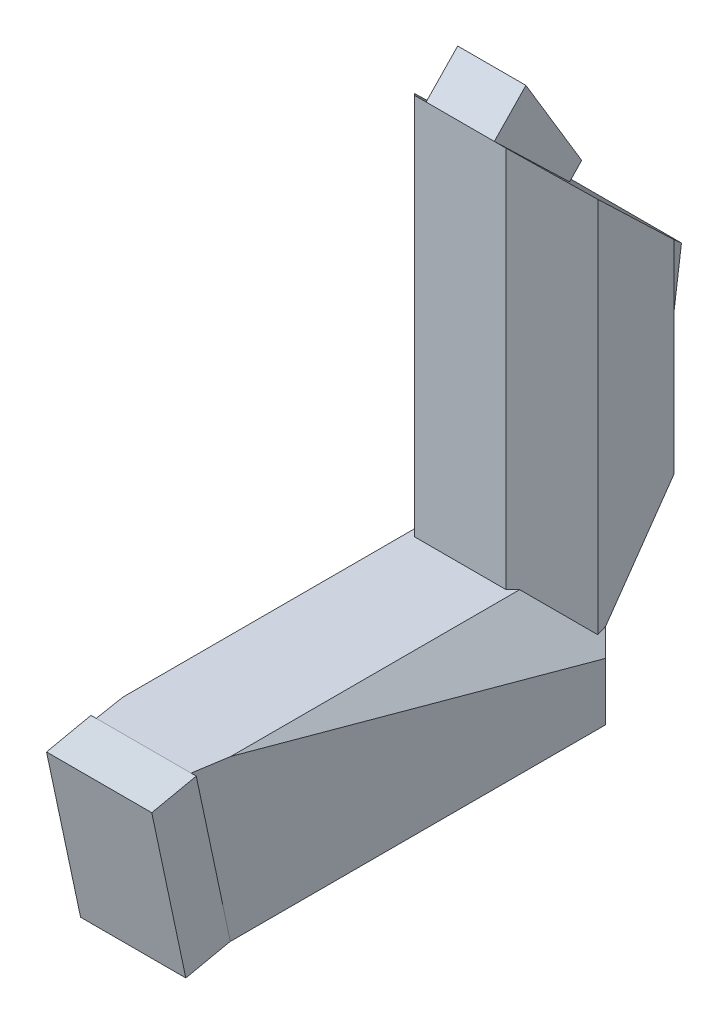
ISO-10303-21;
HEADER;
FILE_DESCRIPTION(('STEP AP214'),'2;1');
FILE_NAME('part.step','',(''),(''),'','','');
FILE_SCHEMA(('AUTOMOTIVE_DESIGN { 1 0 10303 214 1 1 1 1 }'));
ENDSEC;
DATA;
#1=APPLICATION_CONTEXT('core data for automotive mechanical design processes');
#2=APPLICATION_PROTOCOL_DEFINITION('international standard','automotive_design',2000,#1);
#3=PRODUCT_CONTEXT('',#1,'mechanical');
#4=PRODUCT('Part','Part','',(#3));
#5=PRODUCT_RELATED_PRODUCT_CATEGORY('part','',(#4));
#6=PRODUCT_DEFINITION_FORMATION('','',#4);
#7=PRODUCT_DEFINITION_CONTEXT('part definition',#1,'design');
#8=PRODUCT_DEFINITION('design','',#6,#7);
#9=PRODUCT_DEFINITION_SHAPE('','',#8);
#10=(LENGTH_UNIT() NAMED_UNIT(*) SI_UNIT(.MILLI.,.METRE.));
#11=(NAMED_UNIT(*) PLANE_ANGLE_UNIT() SI_UNIT($,.RADIAN.));
#12=(NAMED_UNIT(*) SI_UNIT($,.STERADIAN.) SOLID_ANGLE_UNIT());
#13=UNCERTAINTY_MEASURE_WITH_UNIT(LENGTH_MEASURE(1.E-05),#10,'distance_accuracy_value','');
#14=(GEOMETRIC_REPRESENTATION_CONTEXT(3) GLOBAL_UNCERTAINTY_ASSIGNED_CONTEXT((#13)) GLOBAL_UNIT_ASSIGNED_CONTEXT((#10,
#11,#12)) REPRESENTATION_CONTEXT('',''));
#15=CARTESIAN_POINT('',(0.,0.,0.));
#16=DIRECTION('',(0.,0.,1.));
#17=DIRECTION('',(1.,0.,0.));
#18=AXIS2_PLACEMENT_3D('',#15,#16,#17);
#19=CARTESIAN_POINT('',(-0.0406399999999992,16.9835922280597,2.22888333721219));
#20=DIRECTION('',(0.,-0.719339800338655,0.694658370458993));
#21=DIRECTION('',(1.,0.,0.));
#22=AXIS2_PLACEMENT_3D('',#19,#20,#21);
#23=PLANE('',#22);
#24=DIRECTION('',(-1.,0.,0.));
#25=VECTOR('',#24,1.);
#26=CARTESIAN_POINT('',(0.,22.8152871634944,8.26778022363376));
#27=LINE('',#26,#25);
#28=CARTESIAN_POINT('',(6.985,22.8152871634944,8.26778022363375));
#29=VERTEX_POINT('',#28);
#30=CARTESIAN_POINT('',(3.175,22.8152871634944,8.26778022363376));
#31=VERTEX_POINT('',#30);
#32=EDGE_CURVE('E246',#29,#31,#27,.T.);
#33=ORIENTED_EDGE('',*,*,#32,.F.);
#34=DIRECTION('',(0.,-0.694658370458993,-0.719339800338655));
#35=VECTOR('',#34,1.);
#36=CARTESIAN_POINT('',(6.985,7.67439274365707,-7.41107492601042));
#37=LINE('',#36,#35);
#38=CARTESIAN_POINT('',(6.985,26.8734813637158,12.4701633372122));
#39=VERTEX_POINT('',#38);
#40=EDGE_CURVE('E243',#39,#29,#37,.T.);
#41=ORIENTED_EDGE('',*,*,#40,.F.);
#42=DIRECTION('',(1.,0.,0.));
#43=VECTOR('',#42,1.);
#44=CARTESIAN_POINT('',(-0.0406399999999992,26.8734813637158,12.4701633372122));
#45=LINE('',#44,#43);
#46=CARTESIAN_POINT('',(7.64032,26.8734813637158,12.4701633372122));
#47=VERTEX_POINT('',#46);
#48=EDGE_CURVE('E414',#47,#39,#45,.F.);
#49=ORIENTED_EDGE('',*,*,#48,.F.);
#50=DIRECTION('',(-0.583951705334851,0.563915606871309,0.583951705334853));
#51=VECTOR('',#50,1.);
#52=CARTESIAN_POINT('',(15.1728378685033,19.5994134120685,4.93764546870888));
#53=LINE('',#52,#51);
#54=CARTESIAN_POINT('',(10.20064,24.4010090798018,9.90984333721217));
#55=VERTEX_POINT('',#54);
#56=EDGE_CURVE('E411',#55,#47,#53,.T.);
#57=ORIENTED_EDGE('',*,*,#56,.F.);
#58=DIRECTION('',(-0.125830861752583,-0.689137023900374,-0.713622278604262));
#59=VECTOR('',#58,1.);
#60=CARTESIAN_POINT('',(8.43149552116656,14.7119475569596,-0.123473581872873));
#61=LINE('',#60,#59);
#62=CARTESIAN_POINT('',(9.29087441650168,19.4185021023661,4.75030632340443));
#63=VERTEX_POINT('',#62);
#64=EDGE_CURVE('E409',#63,#55,#61,.F.);
#65=ORIENTED_EDGE('',*,*,#64,.F.);
#66=DIRECTION('',(0.449846069130696,0.620403631273811,0.642446766969786));
#67=VECTOR('',#66,1.);
#68=CARTESIAN_POINT('',(3.90156669892868,11.9858572323209,-2.94642275116742));
#69=LINE('',#68,#67);
#70=CARTESIAN_POINT('',(8.2976543894501,18.0487061794464,3.33184112151435));
#71=VERTEX_POINT('',#70);
#72=EDGE_CURVE('E407',#71,#63,#69,.T.);
#73=ORIENTED_EDGE('',*,*,#72,.F.);
#74=DIRECTION('',(1.,0.,0.));
#75=VECTOR('',#74,1.);
#76=CARTESIAN_POINT('',(0.,18.0487061794464,3.33184112151435));
#77=LINE('',#76,#75);
#78=CARTESIAN_POINT('',(1.8623456105499,18.0487061794464,3.33184112151435));
#79=VERTEX_POINT('',#78);
#80=EDGE_CURVE('E404',#79,#71,#77,.T.);
#81=ORIENTED_EDGE('',*,*,#80,.F.);
#82=DIRECTION('',(0.449846069130696,-0.620403631273811,-0.642446766969786));
#83=VECTOR('',#82,1.);
#84=CARTESIAN_POINT('',(6.25843330107131,11.9858572323209,-2.94642275116742));
#85=LINE('',#84,#83);
#86=CARTESIAN_POINT('',(0.869125583498314,19.4185021023661,4.75030632340443));
#87=VERTEX_POINT('',#86);
#88=EDGE_CURVE('E421',#87,#79,#85,.T.);
#89=ORIENTED_EDGE('',*,*,#88,.F.);
#90=DIRECTION('',(-0.125830861752583,0.689137023900374,0.713622278604262));
#91=VECTOR('',#90,1.);
#92=CARTESIAN_POINT('',(1.72850447883344,14.7119475569596,-0.123473581872865));
#93=LINE('',#92,#91);
#94=CARTESIAN_POINT('',(-0.0406400000000032,24.4010090798018,9.90984333721217));
#95=VERTEX_POINT('',#94);
#96=EDGE_CURVE('E419',#95,#87,#93,.F.);
#97=ORIENTED_EDGE('',*,*,#96,.F.);
#98=DIRECTION('',(-0.58395170533485,-0.563915606871309,-0.583951705334853));
#99=VECTOR('',#98,1.);
#100=CARTESIAN_POINT('',(-5.01283786850328,19.5994134120685,4.93764546870888));
#101=LINE('',#100,#99);
#102=CARTESIAN_POINT('',(2.51968,26.8734813637158,12.4701633372122));
#103=VERTEX_POINT('',#102);
#104=EDGE_CURVE('E417',#103,#95,#101,.T.);
#105=ORIENTED_EDGE('',*,*,#104,.F.);
#106=CARTESIAN_POINT('',(3.175,26.8734813637158,12.4701633372122));
#107=VERTEX_POINT('',#106);
#108=EDGE_CURVE('E413',#107,#103,#45,.F.);
#109=ORIENTED_EDGE('',*,*,#108,.F.);
#110=DIRECTION('',(0.,0.694658370458993,0.719339800338655));
#111=VECTOR('',#110,1.);
#112=CARTESIAN_POINT('',(3.175,7.67439274365707,-7.41107492601042));
#113=LINE('',#112,#111);
#114=EDGE_CURVE('E259',#31,#107,#113,.T.);
#115=ORIENTED_EDGE('',*,*,#114,.F.);
#116=EDGE_LOOP('',(#33,#41,#49,#57,#65,#73,#81,#89,#97,#105,#109,#115));
#117=FACE_BOUND('',#116,.T.);
#118=ADVANCED_FACE('F37',(#117),#23,.F.);
#119=CARTESIAN_POINT('',(2.63464496544535,3.99911222805982,2.22888333721219));
#120=DIRECTION('',(0.819152044288995,0.,0.573576436351042));
#121=DIRECTION('',(0.,1.,0.));
#122=AXIS2_PLACEMENT_3D('',#119,#120,#121);
#123=PLANE('',#122);
#124=DIRECTION('',(0.,-1.,0.));
#125=VECTOR('',#124,1.);
#126=CARTESIAN_POINT('',(0.869125583498317,3.99911222805982,4.75030632340443));
#127=LINE('',#126,#125);
#128=CARTESIAN_POINT('',(0.869125583498321,15.8644613126657,4.75030632340443));
#129=VERTEX_POINT('',#128);
#130=EDGE_CURVE('E297',#87,#129,#127,.T.);
#131=ORIENTED_EDGE('',*,*,#130,.F.);
#132=ORIENTED_EDGE('',*,*,#88,.T.);
#133=DIRECTION('',(-0.356328192511375,-0.783620954253866,0.508889397881147));
#134=VECTOR('',#133,1.);
#135=CARTESIAN_POINT('',(-1.76260983441045,10.0768670025143,8.50881401476351));
#136=LINE('',#135,#134);
#137=EDGE_CURVE('E305',#79,#129,#136,.T.);
#138=ORIENTED_EDGE('',*,*,#137,.T.);
#139=EDGE_LOOP('',(#131,#132,#138));
#140=FACE_BOUND('',#139,.T.);
#141=ADVANCED_FACE('F489',(#140),#123,.F.);
#142=CARTESIAN_POINT('',(7.52535503455466,3.99911222805982,2.22888333721219));
#143=DIRECTION('',(-0.819152044288994,0.,0.573576436351042));
#144=DIRECTION('',(0.,-1.,0.));
#145=AXIS2_PLACEMENT_3D('',#142,#143,#144);
#146=PLANE('',#145);
#147=DIRECTION('',(-0.356328192511376,0.783620954253866,-0.508889397881147));
#148=VECTOR('',#147,1.);
#149=CARTESIAN_POINT('',(11.9226098344105,10.0768670025143,8.50881401476351));
#150=LINE('',#149,#148);
#151=CARTESIAN_POINT('',(9.29087441650168,15.8644613126657,4.75030632340443));
#152=VERTEX_POINT('',#151);
#153=EDGE_CURVE('E302',#152,#71,#150,.T.);
#154=ORIENTED_EDGE('',*,*,#153,.T.);
#155=ORIENTED_EDGE('',*,*,#72,.T.);
#156=DIRECTION('',(0.,1.,0.));
#157=VECTOR('',#156,1.);
#158=CARTESIAN_POINT('',(9.29087441650168,3.99911222805982,4.75030632340443));
#159=LINE('',#158,#157);
#160=EDGE_CURVE('E299',#152,#63,#159,.T.);
#161=ORIENTED_EDGE('',*,*,#160,.F.);
#162=EDGE_LOOP('',(#154,#155,#161));
#163=FACE_BOUND('',#162,.T.);
#164=ADVANCED_FACE('F494',(#163),#146,.F.);
#165=CARTESIAN_POINT('',(-0.0406399999999992,3.99911222805982,12.4701633372122));
#166=DIRECTION('',(0.,0.,-1.));
#167=DIRECTION('',(-1.,0.,0.));
#168=AXIS2_PLACEMENT_3D('',#165,#166,#167);
#169=PLANE('',#168);
#170=DIRECTION('',(0.,1.,0.));
#171=VECTOR('',#170,1.);
#172=CARTESIAN_POINT('',(7.64032,3.99911222805982,12.4701633372122));
#173=LINE('',#172,#171);
#174=CARTESIAN_POINT('',(7.64032,5.52311222805981,12.4701633372122));
#175=VERTEX_POINT('',#174);
#176=EDGE_CURVE('E289',#175,#47,#173,.T.);
#177=ORIENTED_EDGE('',*,*,#176,.T.);
#178=ORIENTED_EDGE('',*,*,#48,.T.);
#179=DIRECTION('',(1.,0.,0.));
#180=VECTOR('',#179,1.);
#181=CARTESIAN_POINT('',(0.,26.8734813637158,12.4701633372122));
#182=LINE('',#181,#180);
#183=EDGE_CURVE('E255',#107,#39,#182,.T.);
#184=ORIENTED_EDGE('',*,*,#183,.F.);
#185=ORIENTED_EDGE('',*,*,#108,.T.);
#186=DIRECTION('',(0.,-1.,0.));
#187=VECTOR('',#186,1.);
#188=CARTESIAN_POINT('',(2.51968,3.99911222805982,12.4701633372122));
#189=LINE('',#188,#187);
#190=CARTESIAN_POINT('',(2.51967999999999,5.52311222805981,12.4701633372122));
#191=VERTEX_POINT('',#190);
#192=EDGE_CURVE('E287',#103,#191,#189,.T.);
#193=ORIENTED_EDGE('',*,*,#192,.T.);
#194=DIRECTION('',(1.,0.,0.));
#195=VECTOR('',#194,1.);
#196=CARTESIAN_POINT('',(-0.0406399999999992,5.52311222805981,12.4701633372122));
#197=LINE('',#196,#195);
#198=EDGE_CURVE('E278',#191,#175,#197,.T.);
#199=ORIENTED_EDGE('',*,*,#198,.T.);
#200=EDGE_LOOP('',(#177,#178,#184,#185,#193,#199));
#201=FACE_BOUND('',#200,.T.);
#202=ADVANCED_FACE('F514',(#201),#169,.F.);
#203=CARTESIAN_POINT('',(7.64032,3.99911222805982,12.4701633372122));
#204=DIRECTION('',(-0.707106781186549,0.,-0.707106781186546));
#205=DIRECTION('',(0.,1.,0.));
#206=AXIS2_PLACEMENT_3D('',#203,#204,#205);
#207=PLANE('',#206);
#208=DIRECTION('',(0.,-1.,0.));
#209=VECTOR('',#208,1.);
#210=CARTESIAN_POINT('',(10.20064,3.99911222805982,9.90984333721217));
#211=LINE('',#210,#209);
#212=CARTESIAN_POINT('',(10.20064,3.34334664456153,9.90984333721217));
#213=VERTEX_POINT('',#212);
#214=EDGE_CURVE('E292',#55,#213,#211,.T.);
#215=ORIENTED_EDGE('',*,*,#214,.F.);
#216=ORIENTED_EDGE('',*,*,#56,.T.);
#217=ORIENTED_EDGE('',*,*,#176,.F.);
#218=DIRECTION('',(0.707106781186546,0.,-0.707106781186549));
#219=VECTOR('',#218,1.);
#220=CARTESIAN_POINT('',(7.64032,5.52311222805981,12.4701633372122));
#221=LINE('',#220,#219);
#222=CARTESIAN_POINT('',(8.02087441650169,5.52311222805981,12.0896089207105));
#223=VERTEX_POINT('',#222);
#224=EDGE_CURVE('E275',#223,#175,#221,.F.);
#225=ORIENTED_EDGE('',*,*,#224,.F.);
#226=DIRECTION('',(0.577350269189624,-0.577350269189627,-0.577350269189626));
#227=VECTOR('',#226,1.);
#228=CARTESIAN_POINT('',(2.00064194893706,11.5433446956245,18.1098413882752));
#229=LINE('',#228,#227);
#230=EDGE_CURVE('E361',#223,#213,#229,.T.);
#231=ORIENTED_EDGE('',*,*,#230,.T.);
#232=EDGE_LOOP('',(#215,#216,#217,#225,#231));
#233=FACE_BOUND('',#232,.T.);
#234=ADVANCED_FACE('F520',(#233),#207,.F.);
#235=CARTESIAN_POINT('',(2.51968,3.99911222805982,12.4701633372122));
#236=DIRECTION('',(0.707106781186549,0.,-0.707106781186546));
#237=DIRECTION('',(0.,-1.,0.));
#238=AXIS2_PLACEMENT_3D('',#235,#236,#237);
#239=PLANE('',#238);
#240=ORIENTED_EDGE('',*,*,#192,.F.);
#241=ORIENTED_EDGE('',*,*,#104,.T.);
#242=DIRECTION('',(0.,1.,0.));
#243=VECTOR('',#242,1.);
#244=CARTESIAN_POINT('',(-0.0406399999999992,3.99911222805982,9.90984333721217));
#245=LINE('',#244,#243);
#246=CARTESIAN_POINT('',(-0.0406399999999991,3.34334664456152,9.90984333721217));
#247=VERTEX_POINT('',#246);
#248=EDGE_CURVE('E294',#247,#95,#245,.T.);
#249=ORIENTED_EDGE('',*,*,#248,.F.);
#250=DIRECTION('',(0.577350269189626,0.577350269189623,0.577350269189628));
#251=VECTOR('',#250,1.);
#252=CARTESIAN_POINT('',(5.61935805106301,9.00334469562446,15.5698413882752));
#253=LINE('',#252,#251);
#254=CARTESIAN_POINT('',(2.13912558349834,5.52311222805981,12.0896089207105));
#255=VERTEX_POINT('',#254);
#256=EDGE_CURVE('E369',#247,#255,#253,.T.);
#257=ORIENTED_EDGE('',*,*,#256,.T.);
#258=DIRECTION('',(0.707106781186546,0.,0.707106781186549));
#259=VECTOR('',#258,1.);
#260=CARTESIAN_POINT('',(2.51968,5.52311222805981,12.4701633372122));
#261=LINE('',#260,#259);
#262=EDGE_CURVE('E281',#191,#255,#261,.F.);
#263=ORIENTED_EDGE('',*,*,#262,.F.);
#264=EDGE_LOOP('',(#240,#241,#249,#257,#263));
#265=FACE_BOUND('',#264,.T.);
#266=ADVANCED_FACE('F544',(#265),#239,.F.);
#267=CARTESIAN_POINT('',(-0.0406399999999992,3.99911222805982,9.9098433372124));
#268=DIRECTION('',(-0.984807753012208,0.,-0.173648177666928));
#269=DIRECTION('',(0.,1.,0.));
#270=AXIS2_PLACEMENT_3D('',#267,#268,#269);
#271=PLANE('',#270);
#272=ORIENTED_EDGE('',*,*,#248,.T.);
#273=ORIENTED_EDGE('',*,*,#96,.T.);
#274=ORIENTED_EDGE('',*,*,#130,.T.);
#275=DIRECTION('',(0.,-1.,0.));
#276=VECTOR('',#275,1.);
#277=CARTESIAN_POINT('',(0.869125583498321,15.6831122280598,4.75030632340443));
#278=LINE('',#277,#276);
#279=CARTESIAN_POINT('',(0.869125583498321,8.06311222805982,4.75030632340443));
#280=VERTEX_POINT('',#279);
#281=EDGE_CURVE('E284',#129,#280,#278,.T.);
#282=ORIENTED_EDGE('',*,*,#281,.T.);
#283=DIRECTION('',(0.123724030206482,0.701673843159866,-0.701673843159862));
#284=VECTOR('',#283,1.);
#285=CARTESIAN_POINT('',(0.0544678580354929,3.4429586804313,9.37045987103293));
#286=LINE('',#285,#284);
#287=CARTESIAN_POINT('',(0.0535036306546003,3.43749027521606,9.37592827624816));
#288=VERTEX_POINT('',#287);
#289=EDGE_CURVE('E315',#280,#288,#286,.F.);
#290=ORIENTED_EDGE('',*,*,#289,.T.);
#291=DIRECTION('',(0.171087869746033,0.171087869746032,-0.970287525247815));
#292=VECTOR('',#291,1.);
#293=CARTESIAN_POINT('',(-3.4960838107961,-0.112097166234596,29.5066390000911));
#294=LINE('',#293,#292);
#295=EDGE_CURVE('E366',#288,#247,#294,.F.);
#296=ORIENTED_EDGE('',*,*,#295,.T.);
#297=EDGE_LOOP('',(#272,#273,#274,#282,#290,#296));
#298=FACE_BOUND('',#297,.T.);
#299=ADVANCED_FACE('F541',(#298),#271,.T.);
#300=CARTESIAN_POINT('',(10.20064,3.99911222805982,9.90984333721239));
#301=DIRECTION('',(0.984807753012208,0.,-0.173648177666928));
#302=DIRECTION('',(0.,-1.,0.));
#303=AXIS2_PLACEMENT_3D('',#300,#301,#302);
#304=PLANE('',#303);
#305=ORIENTED_EDGE('',*,*,#160,.T.);
#306=ORIENTED_EDGE('',*,*,#64,.T.);
#307=ORIENTED_EDGE('',*,*,#214,.T.);
#308=DIRECTION('',(0.171087869746033,-0.171087869746034,0.970287525247815));
#309=VECTOR('',#308,1.);
#310=CARTESIAN_POINT('',(13.4330383398884,0.110948304673054,28.2416852759843));
#311=LINE('',#310,#309);
#312=CARTESIAN_POINT('',(10.1064963693454,3.43749027521607,9.37592827624815));
#313=VERTEX_POINT('',#312);
#314=EDGE_CURVE('E364',#213,#313,#311,.F.);
#315=ORIENTED_EDGE('',*,*,#314,.T.);
#316=DIRECTION('',(0.123724030206482,-0.701673843159866,0.701673843159862));
#317=VECTOR('',#316,1.);
#318=CARTESIAN_POINT('',(10.1055321419645,3.4429586804313,9.37045987103292));
#319=LINE('',#318,#317);
#320=CARTESIAN_POINT('',(9.29087441650168,8.06311222805982,4.75030632340443));
#321=VERTEX_POINT('',#320);
#322=EDGE_CURVE('E311',#313,#321,#319,.F.);
#323=ORIENTED_EDGE('',*,*,#322,.T.);
#324=EDGE_CURVE('E300',#321,#152,#159,.T.);
#325=ORIENTED_EDGE('',*,*,#324,.T.);
#326=EDGE_LOOP('',(#305,#306,#307,#315,#323,#325));
#327=FACE_BOUND('',#326,.T.);
#328=ADVANCED_FACE('F526',(#327),#304,.T.);
#329=CARTESIAN_POINT('',(0.869125583498321,5.52311222805981,30.1503063234044));
#330=DIRECTION('',(0.,1.,0.));
#331=DIRECTION('',(0.,0.,1.));
#332=AXIS2_PLACEMENT_3D('',#329,#330,#331);
#333=PLANE('',#332);
#334=DIRECTION('',(0.156434465040238,0.,0.987688340595137));
#335=VECTOR('',#334,1.);
#336=CARTESIAN_POINT('',(2.38488045776249,5.52311222805981,29.9102343359749));
#337=LINE('',#336,#335);
#338=CARTESIAN_POINT('',(2.13912558349834,5.52311222805981,28.3585991263509));
#339=VERTEX_POINT('',#338);
#340=CARTESIAN_POINT('',(2.42199237299256,5.52311222805981,30.1445497469712));
#341=VERTEX_POINT('',#340);
#342=EDGE_CURVE('E375',#339,#341,#337,.T.);
#343=ORIENTED_EDGE('',*,*,#342,.T.);
#344=DIRECTION('',(-1.,0.,0.));
#345=VECTOR('',#344,1.);
#346=CARTESIAN_POINT('',(0.869125583498321,5.52311222805981,30.1445497469712));
#347=LINE('',#346,#345);
#348=CARTESIAN_POINT('',(7.7153887291366,5.52311222805981,30.1445497469712));
#349=VERTEX_POINT('',#348);
#350=EDGE_CURVE('E400',#341,#349,#347,.F.);
#351=ORIENTED_EDGE('',*,*,#350,.T.);
#352=DIRECTION('',(0.156434465040238,0.,-0.987688340595137));
#353=VECTOR('',#352,1.);
#354=CARTESIAN_POINT('',(7.54695930480912,5.52311222805981,31.2079712799346));
#355=LINE('',#354,#353);
#356=CARTESIAN_POINT('',(8.02087441650169,5.52311222805981,28.2157890256584));
#357=VERTEX_POINT('',#356);
#358=EDGE_CURVE('E387',#349,#357,#355,.T.);
#359=ORIENTED_EDGE('',*,*,#358,.T.);
#360=DIRECTION('',(0.,0.,-1.));
#361=VECTOR('',#360,1.);
#362=CARTESIAN_POINT('',(8.02087441650169,5.52311222805981,30.1503063234044));
#363=LINE('',#362,#361);
#364=EDGE_CURVE('E340',#357,#223,#363,.T.);
#365=ORIENTED_EDGE('',*,*,#364,.T.);
#366=ORIENTED_EDGE('',*,*,#224,.T.);
#367=ORIENTED_EDGE('',*,*,#198,.F.);
#368=ORIENTED_EDGE('',*,*,#262,.T.);
#369=DIRECTION('',(0.,0.,1.));
#370=VECTOR('',#369,1.);
#371=CARTESIAN_POINT('',(2.13912558349834,5.52311222805981,30.1503063234044));
#372=LINE('',#371,#370);
#373=EDGE_CURVE('E333',#255,#339,#372,.T.);
#374=ORIENTED_EDGE('',*,*,#373,.T.);
#375=EDGE_LOOP('',(#343,#351,#359,#365,#366,#367,#368,#374));
#376=FACE_BOUND('',#375,.T.);
#377=ADVANCED_FACE('F451',(#376),#333,.T.);
#378=CARTESIAN_POINT('',(11.8308744165017,-3.4121255676819,30.1503063234044));
#379=DIRECTION('',(0.,-1.,0.));
#380=DIRECTION('',(0.,0.,-1.));
#381=AXIS2_PLACEMENT_3D('',#378,#379,#380);
#382=PLANE('',#381);
#383=DIRECTION('',(-0.156434465040238,0.,0.987688340595137));
#384=VECTOR('',#383,1.);
#385=CARTESIAN_POINT('',(7.81521239250151,-3.4121255676819,29.5142879412006));
#386=LINE('',#385,#384);
#387=CARTESIAN_POINT('',(8.02087441650168,-3.4121255676819,28.2157890256585));
#388=VERTEX_POINT('',#387);
#389=CARTESIAN_POINT('',(8.0161993358183,-3.4121255676819,28.2453063234044));
#390=VERTEX_POINT('',#389);
#391=EDGE_CURVE('E384',#388,#390,#386,.T.);
#392=ORIENTED_EDGE('',*,*,#391,.T.);
#393=DIRECTION('',(-1.,0.,0.));
#394=VECTOR('',#393,1.);
#395=CARTESIAN_POINT('',(11.8308744165017,-3.4121255676819,28.2453063234044));
#396=LINE('',#395,#394);
#397=CARTESIAN_POINT('',(2.13912558349831,-3.4121255676819,28.2453063234044));
#398=VERTEX_POINT('',#397);
#399=EDGE_CURVE('E391',#390,#398,#396,.T.);
#400=ORIENTED_EDGE('',*,*,#399,.T.);
#401=DIRECTION('',(0.,0.,-1.));
#402=VECTOR('',#401,1.);
#403=CARTESIAN_POINT('',(2.13912558349831,-3.4121255676819,30.1503063234044));
#404=LINE('',#403,#402);
#405=CARTESIAN_POINT('',(2.13912558349831,-3.4121255676819,11.1003063234044));
#406=VERTEX_POINT('',#405);
#407=EDGE_CURVE('E351',#398,#406,#404,.T.);
#408=ORIENTED_EDGE('',*,*,#407,.T.);
#409=DIRECTION('',(1.,0.,0.));
#410=VECTOR('',#409,1.);
#411=CARTESIAN_POINT('',(11.8308744165017,-3.4121255676819,11.1003063234044));
#412=LINE('',#411,#410);
#413=CARTESIAN_POINT('',(8.02087441650168,-3.4121255676819,11.1003063234044));
#414=VERTEX_POINT('',#413);
#415=EDGE_CURVE('E325',#406,#414,#412,.T.);
#416=ORIENTED_EDGE('',*,*,#415,.T.);
#417=DIRECTION('',(0.,0.,1.));
#418=VECTOR('',#417,1.);
#419=CARTESIAN_POINT('',(8.02087441650168,-3.4121255676819,30.1503063234044));
#420=LINE('',#419,#418);
#421=EDGE_CURVE('E353',#414,#388,#420,.T.);
#422=ORIENTED_EDGE('',*,*,#421,.T.);
#423=EDGE_LOOP('',(#392,#400,#408,#416,#422));
#424=FACE_BOUND('',#423,.T.);
#425=ADVANCED_FACE('F563',(#424),#382,.T.);
#426=CARTESIAN_POINT('',(0.869125583498321,15.6831122280598,4.75030632340443));
#427=DIRECTION('',(0.,0.,1.));
#428=DIRECTION('',(1.,0.,0.));
#429=AXIS2_PLACEMENT_3D('',#426,#427,#428);
#430=PLANE('',#429);
#431=ORIENTED_EDGE('',*,*,#324,.F.);
#432=DIRECTION('',(-1.,0.,0.));
#433=VECTOR('',#432,1.);
#434=CARTESIAN_POINT('',(0.869125583498321,8.06311222805982,4.75030632340443));
#435=LINE('',#434,#433);
#436=EDGE_CURVE('E313',#321,#280,#435,.T.);
#437=ORIENTED_EDGE('',*,*,#436,.T.);
#438=ORIENTED_EDGE('',*,*,#281,.F.);
#439=DIRECTION('',(-1.,0.,0.));
#440=VECTOR('',#439,1.);
#441=CARTESIAN_POINT('',(0.869125583498321,15.8644613126657,4.75030632340443));
#442=LINE('',#441,#440);
#443=EDGE_CURVE('E308',#129,#152,#442,.F.);
#444=ORIENTED_EDGE('',*,*,#443,.T.);
#445=EDGE_LOOP('',(#431,#437,#438,#444));
#446=FACE_BOUND('',#445,.T.);
#447=ADVANCED_FACE('F575',(#446),#430,.F.);
#448=CARTESIAN_POINT('',(0.,15.6831122280598,4.86807579596692));
#449=DIRECTION('',(0.,0.544639035015032,0.838670567945421));
#450=DIRECTION('',(1.,0.,0.));
#451=AXIS2_PLACEMENT_3D('',#448,#449,#450);
#452=PLANE('',#451);
#453=ORIENTED_EDGE('',*,*,#137,.F.);
#454=ORIENTED_EDGE('',*,*,#80,.T.);
#455=ORIENTED_EDGE('',*,*,#153,.F.);
#456=ORIENTED_EDGE('',*,*,#443,.F.);
#457=EDGE_LOOP('',(#453,#454,#455,#456));
#458=FACE_BOUND('',#457,.T.);
#459=ADVANCED_FACE('F535',(#458),#452,.F.);
#460=CARTESIAN_POINT('',(0.,0.,7.29030632340443));
#461=DIRECTION('',(0.,0.,-1.));
#462=DIRECTION('',(-1.,0.,0.));
#463=AXIS2_PLACEMENT_3D('',#460,#461,#462);
#464=PLANE('',#463);
#465=DIRECTION('',(-1.,0.,0.));
#466=VECTOR('',#465,1.);
#467=CARTESIAN_POINT('',(0.,0.3978744323181,7.29030632340443));
#468=LINE('',#467,#466);
#469=CARTESIAN_POINT('',(8.02087441650169,0.3978744323181,7.29030632340443));
#470=VERTEX_POINT('',#469);
#471=CARTESIAN_POINT('',(2.13912558349832,0.3978744323181,7.29030632340443));
#472=VERTEX_POINT('',#471);
#473=EDGE_CURVE('E320',#470,#472,#468,.T.);
#474=ORIENTED_EDGE('',*,*,#473,.T.);
#475=DIRECTION('',(0.,1.,0.));
#476=VECTOR('',#475,1.);
#477=CARTESIAN_POINT('',(2.13912558349832,0.,7.29030632340443));
#478=LINE('',#477,#476);
#479=CARTESIAN_POINT('',(2.13912558349832,5.52311222805981,7.29030632340443));
#480=VERTEX_POINT('',#479);
#481=EDGE_CURVE('E322',#472,#480,#478,.T.);
#482=ORIENTED_EDGE('',*,*,#481,.T.);
#483=DIRECTION('',(1.,0.,0.));
#484=VECTOR('',#483,1.);
#485=CARTESIAN_POINT('',(11.8308744165017,5.52311222805981,7.29030632340443));
#486=LINE('',#485,#484);
#487=CARTESIAN_POINT('',(8.02087441650169,5.52311222805981,7.29030632340443));
#488=VERTEX_POINT('',#487);
#489=EDGE_CURVE('E272',#480,#488,#486,.T.);
#490=ORIENTED_EDGE('',*,*,#489,.T.);
#491=DIRECTION('',(0.,-1.,0.));
#492=VECTOR('',#491,1.);
#493=CARTESIAN_POINT('',(8.02087441650169,0.,7.29030632340443));
#494=LINE('',#493,#492);
#495=EDGE_CURVE('E318',#488,#470,#494,.T.);
#496=ORIENTED_EDGE('',*,*,#495,.T.);
#497=EDGE_LOOP('',(#474,#482,#490,#496));
#498=FACE_BOUND('',#497,.T.);
#499=ADVANCED_FACE('F569',(#498),#464,.T.);
#500=CARTESIAN_POINT('',(11.8308744165017,5.52311222805981,7.29030632340442));
#501=DIRECTION('',(0.,0.707106781186546,0.707106781186549));
#502=DIRECTION('',(1.,0.,0.));
#503=AXIS2_PLACEMENT_3D('',#500,#501,#502);
#504=PLANE('',#503);
#505=ORIENTED_EDGE('',*,*,#289,.F.);
#506=ORIENTED_EDGE('',*,*,#436,.F.);
#507=ORIENTED_EDGE('',*,*,#322,.F.);
#508=DIRECTION('',(-0.577350269189622,0.577350269189629,-0.577350269189626));
#509=VECTOR('',#508,1.);
#510=CARTESIAN_POINT('',(9.86191182585496,3.68207481870652,9.13134373275771));
#511=LINE('',#510,#509);
#512=EDGE_CURVE('E331',#313,#488,#511,.T.);
#513=ORIENTED_EDGE('',*,*,#512,.T.);
#514=ORIENTED_EDGE('',*,*,#489,.F.);
#515=DIRECTION('',(-0.577350269189623,-0.577350269189629,0.577350269189626));
#516=VECTOR('',#515,1.);
#517=CARTESIAN_POINT('',(0.298088174145055,3.68207481870652,9.1313437327577));
#518=LINE('',#517,#516);
#519=EDGE_CURVE('E328',#480,#288,#518,.T.);
#520=ORIENTED_EDGE('',*,*,#519,.T.);
#521=EDGE_LOOP('',(#505,#506,#507,#513,#514,#520));
#522=FACE_BOUND('',#521,.T.);
#523=ADVANCED_FACE('F572',(#522),#504,.F.);
#524=CARTESIAN_POINT('',(8.02087441650169,0.,7.29030632340443));
#525=DIRECTION('',(-0.707106781186549,0.,0.707106781186546));
#526=DIRECTION('',(0.,-1.,0.));
#527=AXIS2_PLACEMENT_3D('',#524,#525,#526);
#528=PLANE('',#527);
#529=DIRECTION('',(0.577350269189624,-0.577350269189627,0.577350269189627));
#530=VECTOR('',#529,1.);
#531=CARTESIAN_POINT('',(9.86191182585496,3.68207481870654,9.13134373275771));
#532=LINE('',#531,#530);
#533=CARTESIAN_POINT('',(10.8819892165148,2.66199742804673,10.1514211234175));
#534=VERTEX_POINT('',#533);
#535=EDGE_CURVE('E344',#313,#534,#532,.T.);
#536=ORIENTED_EDGE('',*,*,#535,.T.);
#537=DIRECTION('',(0.,1.,0.));
#538=VECTOR('',#537,1.);
#539=CARTESIAN_POINT('',(10.8819892165148,0.,10.1514211234175));
#540=LINE('',#539,#538);
#541=CARTESIAN_POINT('',(10.8819892165148,-0.551010767668832,10.1514211234175));
#542=VERTEX_POINT('',#541);
#543=EDGE_CURVE('E380',#534,#542,#540,.F.);
#544=ORIENTED_EDGE('',*,*,#543,.T.);
#545=DIRECTION('',(-0.577350269189626,-0.577350269189623,-0.577350269189629));
#546=VECTOR('',#545,1.);
#547=CARTESIAN_POINT('',(9.15824960572898,-2.27475037845461,8.42768151263173));
#548=LINE('',#547,#546);
#549=CARTESIAN_POINT('',(9.92587441650169,-1.5071255676819,9.19530632340444));
#550=VERTEX_POINT('',#549);
#551=EDGE_CURVE('E342',#542,#550,#548,.T.);
#552=ORIENTED_EDGE('',*,*,#551,.T.);
#553=DIRECTION('',(-0.577350269189625,0.577350269189625,-0.577350269189628));
#554=VECTOR('',#553,1.);
#555=CARTESIAN_POINT('',(8.15349922727438,0.2652496215454,7.42293113417713));
#556=LINE('',#555,#554);
#557=EDGE_CURVE('E276',#470,#550,#556,.F.);
#558=ORIENTED_EDGE('',*,*,#557,.F.);
#559=ORIENTED_EDGE('',*,*,#495,.F.);
#560=ORIENTED_EDGE('',*,*,#512,.F.);
#561=EDGE_LOOP('',(#536,#544,#552,#558,#559,#560));
#562=FACE_BOUND('',#561,.T.);
#563=ADVANCED_FACE('F553',(#562),#528,.F.);
#564=CARTESIAN_POINT('',(0.,0.3978744323181,7.29030632340443));
#565=DIRECTION('',(0.,0.70710678118655,0.707106781186545));
#566=DIRECTION('',(-1.,0.,0.));
#567=AXIS2_PLACEMENT_3D('',#564,#565,#566);
#568=PLANE('',#567);
#569=ORIENTED_EDGE('',*,*,#557,.T.);
#570=DIRECTION('',(-0.577350269189626,-0.577350269189624,0.577350269189627));
#571=VECTOR('',#570,1.);
#572=CARTESIAN_POINT('',(7.88724961100112,-3.54575037318246,11.233931128905));
#573=LINE('',#572,#571);
#574=EDGE_CURVE('E349',#550,#414,#573,.T.);
#575=ORIENTED_EDGE('',*,*,#574,.T.);
#576=ORIENTED_EDGE('',*,*,#415,.F.);
#577=DIRECTION('',(-0.577350269189623,0.577350269189626,-0.577350269189629));
#578=VECTOR('',#577,1.);
#579=CARTESIAN_POINT('',(-1.11391627766779,-0.159083706515788,7.84726446223832));
#580=LINE('',#579,#578);
#581=CARTESIAN_POINT('',(0.234125583498319,-1.5071255676819,9.19530632340444));
#582=VERTEX_POINT('',#581);
#583=EDGE_CURVE('E347',#406,#582,#580,.T.);
#584=ORIENTED_EDGE('',*,*,#583,.T.);
#585=DIRECTION('',(0.577350269189625,0.577350269189625,-0.577350269189628));
#586=VECTOR('',#585,1.);
#587=CARTESIAN_POINT('',(1.42608372233222,-0.315167428848005,8.00334818457054));
#588=LINE('',#587,#586);
#589=EDGE_CURVE('E271',#472,#582,#588,.F.);
#590=ORIENTED_EDGE('',*,*,#589,.F.);
#591=ORIENTED_EDGE('',*,*,#473,.F.);
#592=EDGE_LOOP('',(#569,#575,#576,#584,#590,#591));
#593=FACE_BOUND('',#592,.T.);
#594=ADVANCED_FACE('F565',(#593),#568,.F.);
#595=CARTESIAN_POINT('',(2.13912558349832,0.,7.29030632340443));
#596=DIRECTION('',(0.707106781186549,0.,0.707106781186546));
#597=DIRECTION('',(0.,1.,0.));
#598=AXIS2_PLACEMENT_3D('',#595,#596,#597);
#599=PLANE('',#598);
#600=DIRECTION('',(-0.577350269189624,0.577350269189627,0.577350269189627));
#601=VECTOR('',#600,1.);
#602=CARTESIAN_POINT('',(1.00175039427102,-2.27475037845461,8.42768151263174));
#603=LINE('',#602,#601);
#604=CARTESIAN_POINT('',(-0.741515461070067,-0.531484523113509,10.1709473679728));
#605=VERTEX_POINT('',#604);
#606=EDGE_CURVE('E358',#582,#605,#603,.T.);
#607=ORIENTED_EDGE('',*,*,#606,.T.);
#608=DIRECTION('',(0.,-1.,0.));
#609=VECTOR('',#608,1.);
#610=CARTESIAN_POINT('',(-0.741515461070067,0.,10.1709473679728));
#611=LINE('',#610,#609);
#612=CARTESIAN_POINT('',(-0.741515461070067,2.64247118349142,10.1709473679728));
#613=VERTEX_POINT('',#612);
#614=EDGE_CURVE('E371',#605,#613,#611,.F.);
#615=ORIENTED_EDGE('',*,*,#614,.T.);
#616=DIRECTION('',(0.577350269189626,0.577350269189623,-0.577350269189629));
#617=VECTOR('',#616,1.);
#618=CARTESIAN_POINT('',(0.298088174145069,3.68207481870655,9.13134373275769));
#619=LINE('',#618,#617);
#620=EDGE_CURVE('E356',#613,#288,#619,.T.);
#621=ORIENTED_EDGE('',*,*,#620,.T.);
#622=ORIENTED_EDGE('',*,*,#519,.F.);
#623=ORIENTED_EDGE('',*,*,#481,.F.);
#624=ORIENTED_EDGE('',*,*,#589,.T.);
#625=EDGE_LOOP('',(#607,#615,#621,#622,#623,#624));
#626=FACE_BOUND('',#625,.T.);
#627=ADVANCED_FACE('F463',(#626),#599,.F.);
#628=CARTESIAN_POINT('',(8.02087441650169,5.52311222805981,30.1503063234044));
#629=DIRECTION('',(-0.707106781186549,-0.707106781186546,0.));
#630=DIRECTION('',(0.,0.,-1.));
#631=AXIS2_PLACEMENT_3D('',#628,#629,#630);
#632=PLANE('',#631);
#633=ORIENTED_EDGE('',*,*,#364,.F.);
#634=DIRECTION('',(-0.154554782932114,0.154554782932115,0.975820494837864));
#635=VECTOR('',#634,1.);
#636=CARTESIAN_POINT('',(7.72911491914605,5.81487172541546,30.0578859940083));
#637=LINE('',#636,#635);
#638=EDGE_CURVE('E389',#357,#534,#637,.F.);
#639=ORIENTED_EDGE('',*,*,#638,.T.);
#640=ORIENTED_EDGE('',*,*,#535,.F.);
#641=ORIENTED_EDGE('',*,*,#314,.F.);
#642=ORIENTED_EDGE('',*,*,#230,.F.);
#643=EDGE_LOOP('',(#633,#639,#640,#641,#642));
#644=FACE_BOUND('',#643,.T.);
#645=ADVANCED_FACE('F548',(#644),#632,.F.);
#646=CARTESIAN_POINT('',(11.8308744165017,0.397874432318092,30.1503063234044));
#647=DIRECTION('',(-0.707106781186546,0.707106781186549,0.));
#648=DIRECTION('',(0.,0.,-1.));
#649=AXIS2_PLACEMENT_3D('',#646,#647,#648);
#650=PLANE('',#649);
#651=ORIENTED_EDGE('',*,*,#551,.F.);
#652=DIRECTION('',(0.154554782932114,0.154554782932113,-0.975820494837864));
#653=VECTOR('',#652,1.);
#654=CARTESIAN_POINT('',(7.91113523781126,-3.52186474637232,28.9086549313343));
#655=LINE('',#654,#653);
#656=EDGE_CURVE('E382',#542,#388,#655,.F.);
#657=ORIENTED_EDGE('',*,*,#656,.T.);
#658=ORIENTED_EDGE('',*,*,#421,.F.);
#659=ORIENTED_EDGE('',*,*,#574,.F.);
#660=EDGE_LOOP('',(#651,#657,#658,#659));
#661=FACE_BOUND('',#660,.T.);
#662=ADVANCED_FACE('F560',(#661),#650,.F.);
#663=CARTESIAN_POINT('',(2.13912558349831,-3.4121255676819,30.1503063234044));
#664=DIRECTION('',(0.707106781186549,0.707106781186546,0.));
#665=DIRECTION('',(0.,0.,-1.));
#666=AXIS2_PLACEMENT_3D('',#663,#664,#665);
#667=PLANE('',#666);
#668=ORIENTED_EDGE('',*,*,#407,.F.);
#669=DIRECTION('',(-0.699252778086874,0.699252778086878,0.148630766248355));
#670=VECTOR('',#669,1.);
#671=CARTESIAN_POINT('',(1.94113802632141,-3.214138010505,28.2873898778113));
#672=LINE('',#671,#670);
#673=CARTESIAN_POINT('',(2.12176618188548,-3.39476616606907,28.2489961781238));
#674=VERTEX_POINT('',#673);
#675=EDGE_CURVE('E394',#398,#674,#672,.T.);
#676=ORIENTED_EDGE('',*,*,#675,.T.);
#677=DIRECTION('',(0.154554782932114,-0.154554782932115,0.975820494837864));
#678=VECTOR('',#677,1.);
#679=CARTESIAN_POINT('',(2.40934678639474,-3.68234677057833,30.0647086554353));
#680=LINE('',#679,#678);
#681=EDGE_CURVE('E378',#674,#605,#680,.F.);
#682=ORIENTED_EDGE('',*,*,#681,.T.);
#683=ORIENTED_EDGE('',*,*,#606,.F.);
#684=ORIENTED_EDGE('',*,*,#583,.F.);
#685=EDGE_LOOP('',(#668,#676,#682,#683,#684));
#686=FACE_BOUND('',#685,.T.);
#687=ADVANCED_FACE('F469',(#686),#667,.F.);
#688=CARTESIAN_POINT('',(-1.67087441650168,1.71311222805981,30.1503063234044));
#689=DIRECTION('',(0.707106781186546,-0.707106781186549,0.));
#690=DIRECTION('',(0.,0.,-1.));
#691=AXIS2_PLACEMENT_3D('',#688,#689,#690);
#692=PLANE('',#691);
#693=ORIENTED_EDGE('',*,*,#620,.F.);
#694=DIRECTION('',(-0.154554782932114,-0.154554782932113,-0.975820494837864));
#695=VECTOR('',#694,1.);
#696=CARTESIAN_POINT('',(2.22732646772953,5.611313112291,28.9154775927612));
#697=LINE('',#696,#695);
#698=EDGE_CURVE('E373',#613,#339,#697,.F.);
#699=ORIENTED_EDGE('',*,*,#698,.T.);
#700=ORIENTED_EDGE('',*,*,#373,.F.);
#701=ORIENTED_EDGE('',*,*,#256,.F.);
#702=ORIENTED_EDGE('',*,*,#295,.F.);
#703=EDGE_LOOP('',(#693,#699,#700,#701,#702));
#704=FACE_BOUND('',#703,.T.);
#705=ADVANCED_FACE('F459',(#704),#692,.F.);
#706=CARTESIAN_POINT('',(-0.795467702265605,2.58851894229586,9.83030632340441));
#707=DIRECTION('',(-0.987688340595137,0.,0.156434465040238));
#708=DIRECTION('',(0.,-1.,0.));
#709=AXIS2_PLACEMENT_3D('',#706,#707,#708);
#710=PLANE('',#709);
#711=ORIENTED_EDGE('',*,*,#681,.F.);
#712=DIRECTION('',(-0.0329121369350975,-0.977617688169755,-0.207799054425156));
#713=VECTOR('',#712,1.);
#714=CARTESIAN_POINT('',(2.18515385897165,-1.51190713283038,28.6492102203384));
#715=LINE('',#714,#713);
#716=CARTESIAN_POINT('',(2.1391255834983,-2.87912483575362,28.3585991263507));
#717=VERTEX_POINT('',#716);
#718=EDGE_CURVE('E397',#674,#717,#715,.F.);
#719=ORIENTED_EDGE('',*,*,#718,.T.);
#720=EDGE_CURVE('E396',#717,#341,#715,.F.);
#721=ORIENTED_EDGE('',*,*,#720,.T.);
#722=ORIENTED_EDGE('',*,*,#342,.F.);
#723=ORIENTED_EDGE('',*,*,#698,.F.);
#724=ORIENTED_EDGE('',*,*,#614,.F.);
#725=EDGE_LOOP('',(#711,#719,#721,#722,#723,#724));
#726=FACE_BOUND('',#725,.T.);
#727=ADVANCED_FACE('F447',(#726),#710,.T.);
#728=CARTESIAN_POINT('',(10.9328488043948,2.61113784016672,9.83030632340441));
#729=DIRECTION('',(0.987688340595137,0.,0.156434465040238));
#730=DIRECTION('',(0.,1.,0.));
#731=AXIS2_PLACEMENT_3D('',#728,#729,#730);
#732=PLANE('',#731);
#733=ORIENTED_EDGE('',*,*,#358,.F.);
#734=DIRECTION('',(-0.0329121369350976,0.977617688169755,0.207799054425156));
#735=VECTOR('',#734,1.);
#736=CARTESIAN_POINT('',(7.95149946909806,-1.49028943006895,28.6538052049086));
#737=LINE('',#736,#735);
#738=EDGE_CURVE('E402',#349,#390,#737,.F.);
#739=ORIENTED_EDGE('',*,*,#738,.T.);
#740=ORIENTED_EDGE('',*,*,#391,.F.);
#741=ORIENTED_EDGE('',*,*,#656,.F.);
#742=ORIENTED_EDGE('',*,*,#543,.F.);
#743=ORIENTED_EDGE('',*,*,#638,.F.);
#744=EDGE_LOOP('',(#733,#739,#740,#741,#742,#743));
#745=FACE_BOUND('',#744,.T.);
#746=ADVANCED_FACE('F476',(#745),#732,.T.);
#747=CARTESIAN_POINT('',(11.8308744165017,-3.4121255676819,28.2453063234044));
#748=DIRECTION('',(0.,0.207911690817756,-0.978147600733806));
#749=DIRECTION('',(-1.,0.,0.));
#750=AXIS2_PLACEMENT_3D('',#747,#748,#749);
#751=PLANE('',#750);
#752=DIRECTION('',(0.,-0.978147600733806,-0.207911690817756));
#753=VECTOR('',#752,1.);
#754=CARTESIAN_POINT('',(2.13912558349831,-3.4121255676819,28.2453063234044));
#755=LINE('',#754,#753);
#756=EDGE_CURVE('E242',#717,#398,#755,.T.);
#757=ORIENTED_EDGE('',*,*,#756,.F.);
#758=ORIENTED_EDGE('',*,*,#718,.F.);
#759=ORIENTED_EDGE('',*,*,#675,.F.);
#760=EDGE_LOOP('',(#757,#758,#759));
#761=FACE_BOUND('',#760,.T.);
#762=ADVANCED_FACE('F473',(#761),#751,.F.);
#763=CARTESIAN_POINT('',(6.985,9.50151583651726,-9.17550718697626));
#764=DIRECTION('',(-1.,0.,0.));
#765=DIRECTION('',(0.,0.,1.));
#766=AXIS2_PLACEMENT_3D('',#763,#764,#765);
#767=PLANE('',#766);
#768=DIRECTION('',(0.,-0.719339800338655,0.694658370458993));
#769=VECTOR('',#768,1.);
#770=CARTESIAN_POINT('',(6.985,24.6424102563546,6.50334796266791));
#771=LINE('',#770,#769);
#772=CARTESIAN_POINT('',(6.985,23.516385094785,7.59073782134592));
#773=VERTEX_POINT('',#772);
#774=EDGE_CURVE('E269',#773,#29,#771,.T.);
#775=ORIENTED_EDGE('',*,*,#774,.F.);
#776=DIRECTION('',(0.,0.857167300702108,0.515038074910061));
#777=VECTOR('',#776,1.);
#778=CARTESIAN_POINT('',(6.985,28.7006044565761,10.7057310762464));
#779=LINE('',#778,#777);
#780=CARTESIAN_POINT('',(6.985,28.700604456576,10.7057310762463));
#781=VERTEX_POINT('',#780);
#782=EDGE_CURVE('E11',#773,#781,#779,.T.);
#783=ORIENTED_EDGE('',*,*,#782,.T.);
#784=DIRECTION('',(0.,-0.719339800338655,0.694658370458993));
#785=VECTOR('',#784,1.);
#786=CARTESIAN_POINT('',(6.985,28.700604456576,10.7057310762463));
#787=LINE('',#786,#785);
#788=EDGE_CURVE('E254',#781,#39,#787,.T.);
#789=ORIENTED_EDGE('',*,*,#788,.T.);
#790=ORIENTED_EDGE('',*,*,#40,.T.);
#791=EDGE_LOOP('',(#775,#783,#789,#790));
#792=FACE_BOUND('',#791,.T.);
#793=ADVANCED_FACE('F475',(#792),#767,.F.);
#794=CARTESIAN_POINT('',(0.,24.6424102563546,6.50334796266792));
#795=DIRECTION('',(0.,0.694658370458993,0.719339800338655));
#796=DIRECTION('',(0.,-0.719339800338655,0.694658370458993));
#797=AXIS2_PLACEMENT_3D('',#794,#795,#796);
#798=PLANE('',#797);
#799=DIRECTION('',(0.,-0.719339800338655,0.694658370458993));
#800=VECTOR('',#799,1.);
#801=CARTESIAN_POINT('',(3.175,24.6424102563546,6.50334796266792));
#802=LINE('',#801,#800);
#803=CARTESIAN_POINT('',(3.175,23.516385094785,7.59073782134593));
#804=VERTEX_POINT('',#803);
#805=EDGE_CURVE('E267',#804,#31,#802,.T.);
#806=ORIENTED_EDGE('',*,*,#805,.F.);
#807=DIRECTION('',(1.,0.,0.));
#808=VECTOR('',#807,1.);
#809=CARTESIAN_POINT('',(6.985,23.516385094785,7.59073782134593));
#810=LINE('',#809,#808);
#811=EDGE_CURVE('E45',#804,#773,#810,.T.);
#812=ORIENTED_EDGE('',*,*,#811,.T.);
#813=ORIENTED_EDGE('',*,*,#774,.T.);
#814=ORIENTED_EDGE('',*,*,#32,.T.);
#815=EDGE_LOOP('',(#806,#812,#813,#814));
#816=FACE_BOUND('',#815,.T.);
#817=ADVANCED_FACE('F483',(#816),#798,.F.);
#818=CARTESIAN_POINT('',(3.175,9.50151583651726,-9.17550718697626));
#819=DIRECTION('',(1.,0.,0.));
#820=DIRECTION('',(0.,0.,-1.));
#821=AXIS2_PLACEMENT_3D('',#818,#819,#820);
#822=PLANE('',#821);
#823=DIRECTION('',(0.,-0.719339800338655,0.694658370458993));
#824=VECTOR('',#823,1.);
#825=CARTESIAN_POINT('',(3.175,28.700604456576,10.7057310762463));
#826=LINE('',#825,#824);
#827=CARTESIAN_POINT('',(3.175,28.700604456576,10.7057310762463));
#828=VERTEX_POINT('',#827);
#829=EDGE_CURVE('E265',#828,#107,#826,.T.);
#830=ORIENTED_EDGE('',*,*,#829,.F.);
#831=DIRECTION('',(0.,-0.857167300702108,-0.515038074910061));
#832=VECTOR('',#831,1.);
#833=CARTESIAN_POINT('',(3.175,28.7006044565761,10.7057310762464));
#834=LINE('',#833,#832);
#835=EDGE_CURVE('E59',#828,#804,#834,.T.);
#836=ORIENTED_EDGE('',*,*,#835,.T.);
#837=ORIENTED_EDGE('',*,*,#805,.T.);
#838=ORIENTED_EDGE('',*,*,#114,.T.);
#839=EDGE_LOOP('',(#830,#836,#837,#838));
#840=FACE_BOUND('',#839,.T.);
#841=ADVANCED_FACE('F509',(#840),#822,.F.);
#842=CARTESIAN_POINT('',(0.,28.700604456576,10.7057310762463));
#843=DIRECTION('',(0.,-0.694658370458993,-0.719339800338655));
#844=DIRECTION('',(0.,0.719339800338655,-0.694658370458993));
#845=AXIS2_PLACEMENT_3D('',#842,#843,#844);
#846=PLANE('',#845);
#847=ORIENTED_EDGE('',*,*,#183,.T.);
#848=ORIENTED_EDGE('',*,*,#788,.F.);
#849=DIRECTION('',(1.,0.,0.));
#850=VECTOR('',#849,1.);
#851=CARTESIAN_POINT('',(0.,28.700604456576,10.7057310762463));
#852=LINE('',#851,#850);
#853=EDGE_CURVE('E252',#828,#781,#852,.T.);
#854=ORIENTED_EDGE('',*,*,#853,.F.);
#855=ORIENTED_EDGE('',*,*,#829,.T.);
#856=EDGE_LOOP('',(#847,#848,#854,#855));
#857=FACE_BOUND('',#856,.T.);
#858=ADVANCED_FACE('F506',(#857),#846,.F.);
#859=CARTESIAN_POINT('',(0.,-5.89169741552445,27.7182570570132));
#860=DIRECTION('',(0.,0.207911690817756,-0.978147600733807));
#861=DIRECTION('',(0.,0.978147600733806,0.207911690817756));
#862=AXIS2_PLACEMENT_3D('',#859,#860,#861);
#863=PLANE('',#862);
#864=ORIENTED_EDGE('',*,*,#738,.F.);
#865=ORIENTED_EDGE('',*,*,#350,.F.);
#866=ORIENTED_EDGE('',*,*,#720,.F.);
#867=CARTESIAN_POINT('',(2.13912558349831,5.53280145134322,30.1466092549576));
#868=VERTEX_POINT('',#867);
#869=EDGE_CURVE('E424',#868,#717,#755,.T.);
#870=ORIENTED_EDGE('',*,*,#869,.F.);
#871=DIRECTION('',(-1.,0.,0.));
#872=VECTOR('',#871,1.);
#873=CARTESIAN_POINT('',(2.13912558349831,5.53280145134322,30.1466092549576));
#874=LINE('',#873,#872);
#875=CARTESIAN_POINT('',(8.0161993358183,5.53280145134322,30.1466092549576));
#876=VERTEX_POINT('',#875);
#877=EDGE_CURVE('E237',#876,#868,#874,.T.);
#878=ORIENTED_EDGE('',*,*,#877,.F.);
#879=DIRECTION('',(0.,0.978147600733806,0.207911690817756));
#880=VECTOR('',#879,1.);
#881=CARTESIAN_POINT('',(8.0161993358183,-3.4121255676819,28.2453063234044));
#882=LINE('',#881,#880);
#883=EDGE_CURVE('E427',#390,#876,#882,.T.);
#884=ORIENTED_EDGE('',*,*,#883,.F.);
#885=EDGE_LOOP('',(#864,#865,#866,#870,#878,#884));
#886=FACE_BOUND('',#885,.T.);
#887=ADVANCED_FACE('F441',(#886),#863,.T.);
#888=CARTESIAN_POINT('',(2.13912558349831,-3.940221262359,30.7298012292682));
#889=DIRECTION('',(1.,0.,0.));
#890=DIRECTION('',(0.,0.,-1.));
#891=AXIS2_PLACEMENT_3D('',#888,#889,#890);
#892=PLANE('',#891);
#893=ORIENTED_EDGE('',*,*,#869,.T.);
#894=ORIENTED_EDGE('',*,*,#756,.T.);
#895=DIRECTION('',(0.,0.207911690817756,-0.978147600733806));
#896=VECTOR('',#895,1.);
#897=CARTESIAN_POINT('',(2.13912558349831,-3.940221262359,30.7298012292682));
#898=LINE('',#897,#896);
#899=CARTESIAN_POINT('',(2.13912558349831,-3.940221262359,30.7298012292682));
#900=VERTEX_POINT('',#899);
#901=EDGE_CURVE('E222',#900,#398,#898,.T.);
#902=ORIENTED_EDGE('',*,*,#901,.F.);
#903=DIRECTION('',(0.,-0.978147600733806,-0.207911690817756));
#904=VECTOR('',#903,1.);
#905=CARTESIAN_POINT('',(2.13912558349831,-3.940221262359,30.7298012292682));
#906=LINE('',#905,#904);
#907=CARTESIAN_POINT('',(2.13912558349831,5.00470575666612,32.6311041608215));
#908=VERTEX_POINT('',#907);
#909=EDGE_CURVE('E228',#908,#900,#906,.T.);
#910=ORIENTED_EDGE('',*,*,#909,.F.);
#911=DIRECTION('',(0.,0.207911690817756,-0.978147600733806));
#912=VECTOR('',#911,1.);
#913=CARTESIAN_POINT('',(2.13912558349831,5.00470575666612,32.6311041608215));
#914=LINE('',#913,#912);
#915=EDGE_CURVE('E435',#908,#868,#914,.T.);
#916=ORIENTED_EDGE('',*,*,#915,.T.);
#917=EDGE_LOOP('',(#893,#894,#902,#910,#916));
#918=FACE_BOUND('',#917,.T.);
#919=ADVANCED_FACE('F241',(#918),#892,.F.);
#920=CARTESIAN_POINT('',(2.13912558349831,-3.940221262359,30.7298012292682));
#921=DIRECTION('',(0.,0.978147600733806,0.207911690817756));
#922=DIRECTION('',(0.,-0.207911690817756,0.978147600733806));
#923=AXIS2_PLACEMENT_3D('',#920,#921,#922);
#924=PLANE('',#923);
#925=ORIENTED_EDGE('',*,*,#399,.F.);
#926=DIRECTION('',(0.,0.207911690817756,-0.978147600733806));
#927=VECTOR('',#926,1.);
#928=CARTESIAN_POINT('',(8.0161993358183,-3.940221262359,30.7298012292682));
#929=LINE('',#928,#927);
#930=CARTESIAN_POINT('',(8.0161993358183,-3.940221262359,30.7298012292682));
#931=VERTEX_POINT('',#930);
#932=EDGE_CURVE('E224',#931,#390,#929,.T.);
#933=ORIENTED_EDGE('',*,*,#932,.F.);
#934=DIRECTION('',(1.,0.,0.));
#935=VECTOR('',#934,1.);
#936=CARTESIAN_POINT('',(2.13912558349831,-3.940221262359,30.7298012292682));
#937=LINE('',#936,#935);
#938=EDGE_CURVE('E217',#900,#931,#937,.T.);
#939=ORIENTED_EDGE('',*,*,#938,.F.);
#940=ORIENTED_EDGE('',*,*,#901,.T.);
#941=EDGE_LOOP('',(#925,#933,#939,#940));
#942=FACE_BOUND('',#941,.T.);
#943=ADVANCED_FACE('F220',(#942),#924,.F.);
#944=CARTESIAN_POINT('',(8.0161993358183,-3.940221262359,30.7298012292682));
#945=DIRECTION('',(-1.,0.,0.));
#946=DIRECTION('',(0.,0.,1.));
#947=AXIS2_PLACEMENT_3D('',#944,#945,#946);
#948=PLANE('',#947);
#949=ORIENTED_EDGE('',*,*,#883,.T.);
#950=DIRECTION('',(0.,0.207911690817756,-0.978147600733806));
#951=VECTOR('',#950,1.);
#952=CARTESIAN_POINT('',(8.0161993358183,5.00470575666612,32.6311041608215));
#953=LINE('',#952,#951);
#954=CARTESIAN_POINT('',(8.0161993358183,5.00470575666612,32.6311041608215));
#955=VERTEX_POINT('',#954);
#956=EDGE_CURVE('E248',#955,#876,#953,.T.);
#957=ORIENTED_EDGE('',*,*,#956,.F.);
#958=DIRECTION('',(0.,0.978147600733806,0.207911690817756));
#959=VECTOR('',#958,1.);
#960=CARTESIAN_POINT('',(8.0161993358183,-3.940221262359,30.7298012292682));
#961=LINE('',#960,#959);
#962=EDGE_CURVE('E227',#931,#955,#961,.T.);
#963=ORIENTED_EDGE('',*,*,#962,.F.);
#964=ORIENTED_EDGE('',*,*,#932,.T.);
#965=EDGE_LOOP('',(#949,#957,#963,#964));
#966=FACE_BOUND('',#965,.T.);
#967=ADVANCED_FACE('F684',(#966),#948,.F.);
#968=CARTESIAN_POINT('',(2.13912558349831,5.00470575666612,32.6311041608215));
#969=DIRECTION('',(0.,-0.978147600733806,-0.207911690817756));
#970=DIRECTION('',(0.,0.207911690817756,-0.978147600733806));
#971=AXIS2_PLACEMENT_3D('',#968,#969,#970);
#972=PLANE('',#971);
#973=ORIENTED_EDGE('',*,*,#877,.T.);
#974=ORIENTED_EDGE('',*,*,#915,.F.);
#975=DIRECTION('',(-1.,0.,0.));
#976=VECTOR('',#975,1.);
#977=CARTESIAN_POINT('',(2.13912558349831,5.00470575666612,32.6311041608215));
#978=LINE('',#977,#976);
#979=EDGE_CURVE('E233',#955,#908,#978,.T.);
#980=ORIENTED_EDGE('',*,*,#979,.F.);
#981=ORIENTED_EDGE('',*,*,#956,.T.);
#982=EDGE_LOOP('',(#973,#974,#980,#981));
#983=FACE_BOUND('',#982,.T.);
#984=ADVANCED_FACE('F438',(#983),#972,.F.);
#985=CARTESIAN_POINT('',(0.,-6.41979311020155,30.2027519628771));
#986=DIRECTION('',(0.,0.207911690817756,-0.978147600733807));
#987=DIRECTION('',(0.,0.978147600733806,0.207911690817756));
#988=AXIS2_PLACEMENT_3D('',#985,#986,#987);
#989=PLANE('',#988);
#990=ORIENTED_EDGE('',*,*,#909,.T.);
#991=ORIENTED_EDGE('',*,*,#938,.T.);
#992=ORIENTED_EDGE('',*,*,#962,.T.);
#993=ORIENTED_EDGE('',*,*,#979,.T.);
#994=EDGE_LOOP('',(#990,#991,#992,#993));
#995=FACE_BOUND('',#994,.T.);
#996=ADVANCED_FACE('F231',(#995),#989,.F.);
#997=CARTESIAN_POINT('',(0.,28.7006044565761,10.7057310762464));
#998=DIRECTION('',(0.,0.515038074910061,-0.857167300702108));
#999=DIRECTION('',(1.,0.,0.));
#1000=AXIS2_PLACEMENT_3D('',#997,#998,#999);
#1001=PLANE('',#1000);
#1002=ORIENTED_EDGE('',*,*,#782,.F.);
#1003=ORIENTED_EDGE('',*,*,#811,.F.);
#1004=ORIENTED_EDGE('',*,*,#835,.F.);
#1005=ORIENTED_EDGE('',*,*,#853,.T.);
#1006=EDGE_LOOP('',(#1002,#1003,#1004,#1005));
#1007=FACE_BOUND('',#1006,.T.);
#1008=ADVANCED_FACE('F39',(#1007),#1001,.T.);
#1009=CLOSED_SHELL('',(#118,#141,#164,#202,#234,#266,#299,#328,#377,#425,#447,#459,#499,#523,
#563,#594,#627,#645,#662,#687,#705,#727,#746,#762,#793,#817,#841,#858,#887,#919,#943,#967,#984,
#996,#1008));
#1010=MANIFOLD_SOLID_BREP('B2',#1009);
#1011=ADVANCED_BREP_SHAPE_REPRESENTATION('',(#18,#1010),#14);
#1012=SHAPE_DEFINITION_REPRESENTATION(#9,#1011);
ENDSEC;
END-ISO-10303-21;
